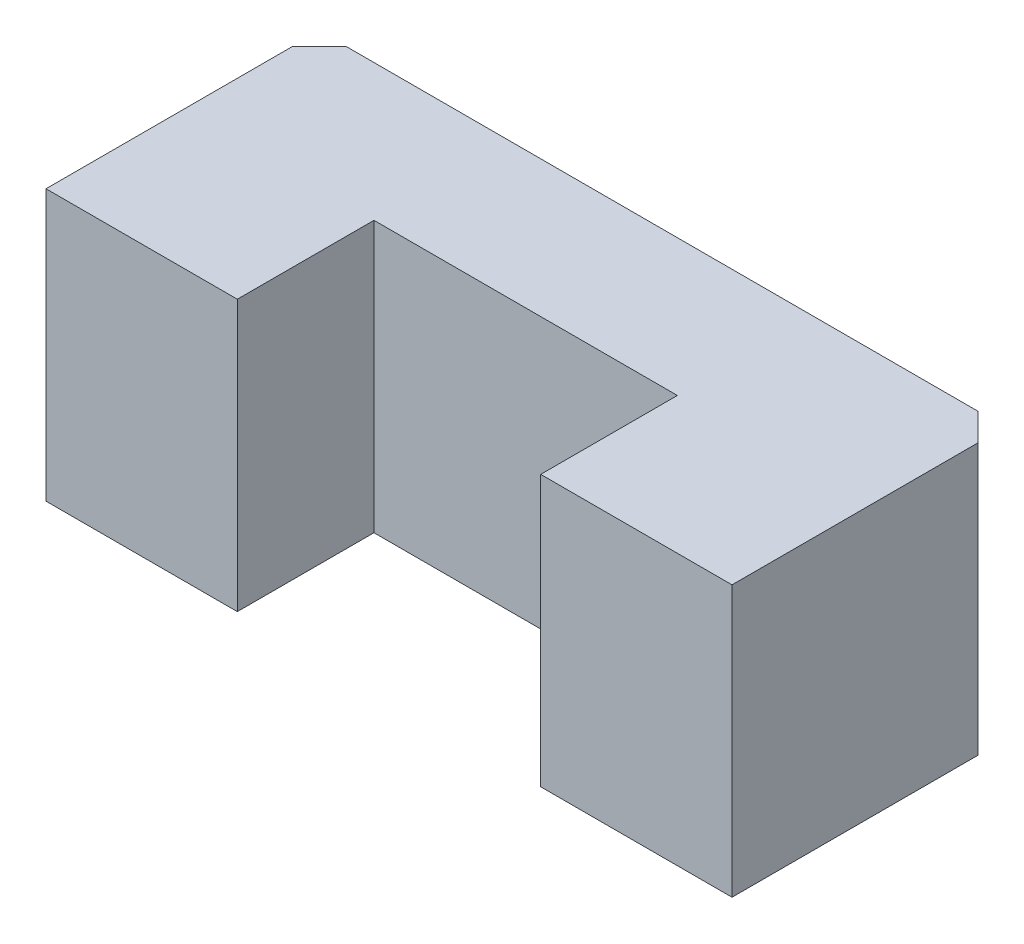
ISO-10303-21;
HEADER;
FILE_DESCRIPTION(('STEP AP214'),'2;1');
FILE_NAME('part.step','',(''),(''),'','','');
FILE_SCHEMA(('AUTOMOTIVE_DESIGN { 1 0 10303 214 1 1 1 1 }'));
ENDSEC;
DATA;
#1=APPLICATION_CONTEXT('core data for automotive mechanical design processes');
#2=APPLICATION_PROTOCOL_DEFINITION('international standard','automotive_design',2000,#1);
#3=PRODUCT_CONTEXT('',#1,'mechanical');
#4=PRODUCT('Part','Part','',(#3));
#5=PRODUCT_RELATED_PRODUCT_CATEGORY('part','',(#4));
#6=PRODUCT_DEFINITION_FORMATION('','',#4);
#7=PRODUCT_DEFINITION_CONTEXT('part definition',#1,'design');
#8=PRODUCT_DEFINITION('design','',#6,#7);
#9=PRODUCT_DEFINITION_SHAPE('','',#8);
#10=(LENGTH_UNIT() NAMED_UNIT(*) SI_UNIT(.MILLI.,.METRE.));
#11=(NAMED_UNIT(*) PLANE_ANGLE_UNIT() SI_UNIT($,.RADIAN.));
#12=(NAMED_UNIT(*) SI_UNIT($,.STERADIAN.) SOLID_ANGLE_UNIT());
#13=UNCERTAINTY_MEASURE_WITH_UNIT(LENGTH_MEASURE(1.E-05),#10,'distance_accuracy_value','');
#14=(GEOMETRIC_REPRESENTATION_CONTEXT(3) GLOBAL_UNCERTAINTY_ASSIGNED_CONTEXT((#13)) GLOBAL_UNIT_ASSIGNED_CONTEXT((#10,
#11,#12)) REPRESENTATION_CONTEXT('',''));
#15=CARTESIAN_POINT('',(0.,0.,0.));
#16=DIRECTION('',(0.,0.,1.));
#17=DIRECTION('',(1.,0.,0.));
#18=AXIS2_PLACEMENT_3D('',#15,#16,#17);
#19=CARTESIAN_POINT('',(0.,4.95,5.));
#20=DIRECTION('',(0.,1.,0.));
#21=DIRECTION('',(0.,0.,1.));
#22=AXIS2_PLACEMENT_3D('',#19,#20,#21);
#23=PLANE('',#22);
#24=DIRECTION('',(0.,0.,-1.));
#25=VECTOR('',#24,1.);
#26=CARTESIAN_POINT('',(12.55,4.95,10.));
#27=LINE('',#26,#25);
#28=CARTESIAN_POINT('',(12.55,4.95,10.));
#29=VERTEX_POINT('',#28);
#30=CARTESIAN_POINT('',(12.55,4.95,1.00000000000001));
#31=VERTEX_POINT('',#30);
#32=EDGE_CURVE('E142',#29,#31,#27,.T.);
#33=ORIENTED_EDGE('',*,*,#32,.T.);
#34=DIRECTION('',(-0.707106781186548,0.,-0.707106781186548));
#35=VECTOR('',#34,1.);
#36=CARTESIAN_POINT('',(8.275,4.95,-3.275));
#37=LINE('',#36,#35);
#38=CARTESIAN_POINT('',(11.55,4.95,0.));
#39=VERTEX_POINT('',#38);
#40=EDGE_CURVE('E43',#31,#39,#37,.T.);
#41=ORIENTED_EDGE('',*,*,#40,.T.);
#42=DIRECTION('',(1.,0.,0.));
#43=VECTOR('',#42,1.);
#44=CARTESIAN_POINT('',(0.,4.95,0.));
#45=LINE('',#44,#43);
#46=CARTESIAN_POINT('',(-11.55,4.95,0.));
#47=VERTEX_POINT('',#46);
#48=EDGE_CURVE('E194',#47,#39,#45,.T.);
#49=ORIENTED_EDGE('',*,*,#48,.F.);
#50=DIRECTION('',(0.707106781186549,0.,-0.707106781186546));
#51=VECTOR('',#50,1.);
#52=CARTESIAN_POINT('',(-8.27499999999998,4.95,-3.27500000000001));
#53=LINE('',#52,#51);
#54=CARTESIAN_POINT('',(-12.55,4.95,1.00000000000001));
#55=VERTEX_POINT('',#54);
#56=EDGE_CURVE('E50',#47,#55,#53,.F.);
#57=ORIENTED_EDGE('',*,*,#56,.T.);
#58=DIRECTION('',(0.,0.,-1.));
#59=VECTOR('',#58,1.);
#60=CARTESIAN_POINT('',(-12.55,4.95,10.));
#61=LINE('',#60,#59);
#62=CARTESIAN_POINT('',(-12.55,4.95,10.));
#63=VERTEX_POINT('',#62);
#64=EDGE_CURVE('E238',#63,#55,#61,.T.);
#65=ORIENTED_EDGE('',*,*,#64,.F.);
#66=DIRECTION('',(1.,0.,0.));
#67=VECTOR('',#66,1.);
#68=CARTESIAN_POINT('',(0.,4.95,10.));
#69=LINE('',#68,#67);
#70=CARTESIAN_POINT('',(-5.55,4.95,10.));
#71=VERTEX_POINT('',#70);
#72=EDGE_CURVE('E153',#63,#71,#69,.T.);
#73=ORIENTED_EDGE('',*,*,#72,.T.);
#74=DIRECTION('',(0.,0.,-1.));
#75=VECTOR('',#74,1.);
#76=CARTESIAN_POINT('',(-5.55,4.95,10.));
#77=LINE('',#76,#75);
#78=CARTESIAN_POINT('',(-5.55,4.95,5.));
#79=VERTEX_POINT('',#78);
#80=EDGE_CURVE('E168',#71,#79,#77,.T.);
#81=ORIENTED_EDGE('',*,*,#80,.T.);
#82=DIRECTION('',(1.,0.,0.));
#83=VECTOR('',#82,1.);
#84=CARTESIAN_POINT('',(0.,4.95,5.));
#85=LINE('',#84,#83);
#86=CARTESIAN_POINT('',(5.55,4.95,5.));
#87=VERTEX_POINT('',#86);
#88=EDGE_CURVE('E121',#79,#87,#85,.T.);
#89=ORIENTED_EDGE('',*,*,#88,.T.);
#90=DIRECTION('',(0.,0.,-1.));
#91=VECTOR('',#90,1.);
#92=CARTESIAN_POINT('',(5.55,4.95,10.));
#93=LINE('',#92,#91);
#94=CARTESIAN_POINT('',(5.55,4.95,10.));
#95=VERTEX_POINT('',#94);
#96=EDGE_CURVE('E114',#95,#87,#93,.T.);
#97=ORIENTED_EDGE('',*,*,#96,.F.);
#98=DIRECTION('',(1.,0.,0.));
#99=VECTOR('',#98,1.);
#100=CARTESIAN_POINT('',(0.,4.95,10.));
#101=LINE('',#100,#99);
#102=EDGE_CURVE('E117',#95,#29,#101,.T.);
#103=ORIENTED_EDGE('',*,*,#102,.T.);
#104=EDGE_LOOP('',(#33,#41,#49,#57,#65,#73,#81,#89,#97,#103));
#105=FACE_BOUND('',#104,.T.);
#106=ADVANCED_FACE('F35',(#105),#23,.T.);
#107=CARTESIAN_POINT('',(0.,-4.95,5.));
#108=DIRECTION('',(0.,1.,0.));
#109=DIRECTION('',(0.,0.,1.));
#110=AXIS2_PLACEMENT_3D('',#107,#108,#109);
#111=PLANE('',#110);
#112=DIRECTION('',(1.,0.,0.));
#113=VECTOR('',#112,1.);
#114=CARTESIAN_POINT('',(0.,-4.95,0.));
#115=LINE('',#114,#113);
#116=CARTESIAN_POINT('',(-11.55,-4.95,0.));
#117=VERTEX_POINT('',#116);
#118=CARTESIAN_POINT('',(11.55,-4.95,0.));
#119=VERTEX_POINT('',#118);
#120=EDGE_CURVE('E178',#117,#119,#115,.T.);
#121=ORIENTED_EDGE('',*,*,#120,.T.);
#122=DIRECTION('',(0.707106781186548,0.,0.707106781186548));
#123=VECTOR('',#122,1.);
#124=CARTESIAN_POINT('',(11.55,-4.95,0.));
#125=LINE('',#124,#123);
#126=CARTESIAN_POINT('',(12.55,-4.95,1.));
#127=VERTEX_POINT('',#126);
#128=EDGE_CURVE('E189',#119,#127,#125,.T.);
#129=ORIENTED_EDGE('',*,*,#128,.T.);
#130=DIRECTION('',(0.,0.,-1.));
#131=VECTOR('',#130,1.);
#132=CARTESIAN_POINT('',(12.55,-4.95,10.));
#133=LINE('',#132,#131);
#134=CARTESIAN_POINT('',(12.55,-4.95,10.));
#135=VERTEX_POINT('',#134);
#136=EDGE_CURVE('E144',#135,#127,#133,.T.);
#137=ORIENTED_EDGE('',*,*,#136,.F.);
#138=DIRECTION('',(1.,0.,0.));
#139=VECTOR('',#138,1.);
#140=CARTESIAN_POINT('',(0.,-4.95,10.));
#141=LINE('',#140,#139);
#142=CARTESIAN_POINT('',(5.55,-4.95,10.));
#143=VERTEX_POINT('',#142);
#144=EDGE_CURVE('E133',#143,#135,#141,.T.);
#145=ORIENTED_EDGE('',*,*,#144,.F.);
#146=DIRECTION('',(0.,0.,-1.));
#147=VECTOR('',#146,1.);
#148=CARTESIAN_POINT('',(5.55,-4.95,10.));
#149=LINE('',#148,#147);
#150=CARTESIAN_POINT('',(5.55,-4.95,5.));
#151=VERTEX_POINT('',#150);
#152=EDGE_CURVE('E125',#143,#151,#149,.T.);
#153=ORIENTED_EDGE('',*,*,#152,.T.);
#154=DIRECTION('',(1.,0.,0.));
#155=VECTOR('',#154,1.);
#156=CARTESIAN_POINT('',(0.,-4.95,5.));
#157=LINE('',#156,#155);
#158=CARTESIAN_POINT('',(-5.55,-4.95,5.));
#159=VERTEX_POINT('',#158);
#160=EDGE_CURVE('E184',#159,#151,#157,.T.);
#161=ORIENTED_EDGE('',*,*,#160,.F.);
#162=DIRECTION('',(0.,0.,-1.));
#163=VECTOR('',#162,1.);
#164=CARTESIAN_POINT('',(-5.55,-4.95,10.));
#165=LINE('',#164,#163);
#166=CARTESIAN_POINT('',(-5.55,-4.95,10.));
#167=VERTEX_POINT('',#166);
#168=EDGE_CURVE('E160',#167,#159,#165,.T.);
#169=ORIENTED_EDGE('',*,*,#168,.F.);
#170=DIRECTION('',(1.,0.,0.));
#171=VECTOR('',#170,1.);
#172=CARTESIAN_POINT('',(0.,-4.95,10.));
#173=LINE('',#172,#171);
#174=CARTESIAN_POINT('',(-12.55,-4.95,10.));
#175=VERTEX_POINT('',#174);
#176=EDGE_CURVE('E158',#175,#167,#173,.T.);
#177=ORIENTED_EDGE('',*,*,#176,.F.);
#178=DIRECTION('',(0.,0.,-1.));
#179=VECTOR('',#178,1.);
#180=CARTESIAN_POINT('',(-12.55,-4.95,10.));
#181=LINE('',#180,#179);
#182=CARTESIAN_POINT('',(-12.55,-4.95,1.));
#183=VERTEX_POINT('',#182);
#184=EDGE_CURVE('E163',#175,#183,#181,.T.);
#185=ORIENTED_EDGE('',*,*,#184,.T.);
#186=DIRECTION('',(-0.707106781186549,0.,0.707106781186546));
#187=VECTOR('',#186,1.);
#188=CARTESIAN_POINT('',(-12.55,-4.95,1.));
#189=LINE('',#188,#187);
#190=EDGE_CURVE('E187',#183,#117,#189,.F.);
#191=ORIENTED_EDGE('',*,*,#190,.T.);
#192=EDGE_LOOP('',(#121,#129,#137,#145,#153,#161,#169,#177,#185,#191));
#193=FACE_BOUND('',#192,.T.);
#194=ADVANCED_FACE('F205',(#193),#111,.F.);
#195=CARTESIAN_POINT('',(0.,0.,5.));
#196=DIRECTION('',(0.,0.,1.));
#197=DIRECTION('',(1.,0.,0.));
#198=AXIS2_PLACEMENT_3D('',#195,#196,#197);
#199=PLANE('',#198);
#200=DIRECTION('',(0.,-1.,0.));
#201=VECTOR('',#200,1.);
#202=CARTESIAN_POINT('',(5.55,0.,5.));
#203=LINE('',#202,#201);
#204=EDGE_CURVE('E175',#87,#151,#203,.T.);
#205=ORIENTED_EDGE('',*,*,#204,.F.);
#206=ORIENTED_EDGE('',*,*,#88,.F.);
#207=DIRECTION('',(0.,-1.,0.));
#208=VECTOR('',#207,1.);
#209=CARTESIAN_POINT('',(-5.55,0.,5.));
#210=LINE('',#209,#208);
#211=EDGE_CURVE('E246',#79,#159,#210,.T.);
#212=ORIENTED_EDGE('',*,*,#211,.T.);
#213=ORIENTED_EDGE('',*,*,#160,.T.);
#214=EDGE_LOOP('',(#205,#206,#212,#213));
#215=FACE_BOUND('',#214,.T.);
#216=ADVANCED_FACE('F221',(#215),#199,.T.);
#217=CARTESIAN_POINT('',(0.,0.,0.));
#218=DIRECTION('',(0.,0.,1.));
#219=DIRECTION('',(1.,0.,0.));
#220=AXIS2_PLACEMENT_3D('',#217,#218,#219);
#221=PLANE('',#220);
#222=ORIENTED_EDGE('',*,*,#48,.T.);
#223=DIRECTION('',(0.,-1.,0.));
#224=VECTOR('',#223,1.);
#225=CARTESIAN_POINT('',(11.55,-4.95,0.));
#226=LINE('',#225,#224);
#227=EDGE_CURVE('E183',#39,#119,#226,.T.);
#228=ORIENTED_EDGE('',*,*,#227,.T.);
#229=ORIENTED_EDGE('',*,*,#120,.F.);
#230=DIRECTION('',(0.,1.,0.));
#231=VECTOR('',#230,1.);
#232=CARTESIAN_POINT('',(-11.55,0.,0.));
#233=LINE('',#232,#231);
#234=EDGE_CURVE('E181',#117,#47,#233,.T.);
#235=ORIENTED_EDGE('',*,*,#234,.T.);
#236=EDGE_LOOP('',(#222,#228,#229,#235));
#237=FACE_BOUND('',#236,.T.);
#238=ADVANCED_FACE('F198',(#237),#221,.F.);
#239=CARTESIAN_POINT('',(-5.55,0.,10.));
#240=DIRECTION('',(1.,0.,0.));
#241=DIRECTION('',(0.,0.,-1.));
#242=AXIS2_PLACEMENT_3D('',#239,#240,#241);
#243=PLANE('',#242);
#244=ORIENTED_EDGE('',*,*,#211,.F.);
#245=ORIENTED_EDGE('',*,*,#80,.F.);
#246=DIRECTION('',(0.,-1.,0.));
#247=VECTOR('',#246,1.);
#248=CARTESIAN_POINT('',(-5.55,0.,10.));
#249=LINE('',#248,#247);
#250=EDGE_CURVE('E124',#71,#167,#249,.T.);
#251=ORIENTED_EDGE('',*,*,#250,.T.);
#252=ORIENTED_EDGE('',*,*,#168,.T.);
#253=EDGE_LOOP('',(#244,#245,#251,#252));
#254=FACE_BOUND('',#253,.T.);
#255=ADVANCED_FACE('F253',(#254),#243,.T.);
#256=CARTESIAN_POINT('',(-12.55,0.,10.));
#257=DIRECTION('',(1.,0.,0.));
#258=DIRECTION('',(0.,0.,-1.));
#259=AXIS2_PLACEMENT_3D('',#256,#257,#258);
#260=PLANE('',#259);
#261=ORIENTED_EDGE('',*,*,#64,.T.);
#262=DIRECTION('',(0.,-1.,0.));
#263=VECTOR('',#262,1.);
#264=CARTESIAN_POINT('',(-12.55,0.,1.));
#265=LINE('',#264,#263);
#266=EDGE_CURVE('E11',#55,#183,#265,.T.);
#267=ORIENTED_EDGE('',*,*,#266,.T.);
#268=ORIENTED_EDGE('',*,*,#184,.F.);
#269=DIRECTION('',(0.,-1.,0.));
#270=VECTOR('',#269,1.);
#271=CARTESIAN_POINT('',(-12.55,0.,10.));
#272=LINE('',#271,#270);
#273=EDGE_CURVE('E156',#63,#175,#272,.T.);
#274=ORIENTED_EDGE('',*,*,#273,.F.);
#275=EDGE_LOOP('',(#261,#267,#268,#274));
#276=FACE_BOUND('',#275,.T.);
#277=ADVANCED_FACE('F235',(#276),#260,.F.);
#278=CARTESIAN_POINT('',(0.,0.,10.));
#279=DIRECTION('',(0.,0.,1.));
#280=DIRECTION('',(1.,0.,0.));
#281=AXIS2_PLACEMENT_3D('',#278,#279,#280);
#282=PLANE('',#281);
#283=ORIENTED_EDGE('',*,*,#250,.F.);
#284=ORIENTED_EDGE('',*,*,#72,.F.);
#285=ORIENTED_EDGE('',*,*,#273,.T.);
#286=ORIENTED_EDGE('',*,*,#176,.T.);
#287=EDGE_LOOP('',(#283,#284,#285,#286));
#288=FACE_BOUND('',#287,.T.);
#289=ADVANCED_FACE('F214',(#288),#282,.T.);
#290=CARTESIAN_POINT('',(5.55,0.,10.));
#291=DIRECTION('',(1.,0.,0.));
#292=DIRECTION('',(0.,0.,-1.));
#293=AXIS2_PLACEMENT_3D('',#290,#291,#292);
#294=PLANE('',#293);
#295=ORIENTED_EDGE('',*,*,#96,.T.);
#296=ORIENTED_EDGE('',*,*,#204,.T.);
#297=ORIENTED_EDGE('',*,*,#152,.F.);
#298=DIRECTION('',(0.,-1.,0.));
#299=VECTOR('',#298,1.);
#300=CARTESIAN_POINT('',(5.55,0.,10.));
#301=LINE('',#300,#299);
#302=EDGE_CURVE('E128',#95,#143,#301,.T.);
#303=ORIENTED_EDGE('',*,*,#302,.F.);
#304=EDGE_LOOP('',(#295,#296,#297,#303));
#305=FACE_BOUND('',#304,.T.);
#306=ADVANCED_FACE('F129',(#305),#294,.F.);
#307=CARTESIAN_POINT('',(12.55,0.,10.));
#308=DIRECTION('',(1.,0.,0.));
#309=DIRECTION('',(0.,0.,-1.));
#310=AXIS2_PLACEMENT_3D('',#307,#308,#309);
#311=PLANE('',#310);
#312=ORIENTED_EDGE('',*,*,#136,.T.);
#313=DIRECTION('',(0.,1.,0.));
#314=VECTOR('',#313,1.);
#315=CARTESIAN_POINT('',(12.55,4.95,1.));
#316=LINE('',#315,#314);
#317=EDGE_CURVE('E58',#127,#31,#316,.T.);
#318=ORIENTED_EDGE('',*,*,#317,.T.);
#319=ORIENTED_EDGE('',*,*,#32,.F.);
#320=DIRECTION('',(0.,-1.,0.));
#321=VECTOR('',#320,1.);
#322=CARTESIAN_POINT('',(12.55,0.,10.));
#323=LINE('',#322,#321);
#324=EDGE_CURVE('E137',#29,#135,#323,.T.);
#325=ORIENTED_EDGE('',*,*,#324,.T.);
#326=EDGE_LOOP('',(#312,#318,#319,#325));
#327=FACE_BOUND('',#326,.T.);
#328=ADVANCED_FACE('F206',(#327),#311,.T.);
#329=CARTESIAN_POINT('',(0.,0.,10.));
#330=DIRECTION('',(0.,0.,1.));
#331=DIRECTION('',(1.,0.,0.));
#332=AXIS2_PLACEMENT_3D('',#329,#330,#331);
#333=PLANE('',#332);
#334=ORIENTED_EDGE('',*,*,#102,.F.);
#335=ORIENTED_EDGE('',*,*,#302,.T.);
#336=ORIENTED_EDGE('',*,*,#144,.T.);
#337=ORIENTED_EDGE('',*,*,#324,.F.);
#338=EDGE_LOOP('',(#334,#335,#336,#337));
#339=FACE_BOUND('',#338,.T.);
#340=ADVANCED_FACE('F135',(#339),#333,.T.);
#341=CARTESIAN_POINT('',(11.55,0.,0.));
#342=DIRECTION('',(0.707106781186547,0.,-0.707106781186547));
#343=DIRECTION('',(0.,1.,0.));
#344=AXIS2_PLACEMENT_3D('',#341,#342,#343);
#345=PLANE('',#344);
#346=ORIENTED_EDGE('',*,*,#40,.F.);
#347=ORIENTED_EDGE('',*,*,#317,.F.);
#348=ORIENTED_EDGE('',*,*,#128,.F.);
#349=ORIENTED_EDGE('',*,*,#227,.F.);
#350=EDGE_LOOP('',(#346,#347,#348,#349));
#351=FACE_BOUND('',#350,.T.);
#352=ADVANCED_FACE('F202',(#351),#345,.T.);
#353=CARTESIAN_POINT('',(-12.55,0.,1.));
#354=DIRECTION('',(0.707106781186546,0.,0.707106781186549));
#355=DIRECTION('',(0.,-1.,0.));
#356=AXIS2_PLACEMENT_3D('',#353,#354,#355);
#357=PLANE('',#356);
#358=ORIENTED_EDGE('',*,*,#56,.F.);
#359=ORIENTED_EDGE('',*,*,#234,.F.);
#360=ORIENTED_EDGE('',*,*,#190,.F.);
#361=ORIENTED_EDGE('',*,*,#266,.F.);
#362=EDGE_LOOP('',(#358,#359,#360,#361));
#363=FACE_BOUND('',#362,.T.);
#364=ADVANCED_FACE('F37',(#363),#357,.F.);
#365=CLOSED_SHELL('',(#106,#194,#216,#238,#255,#277,#289,#306,#328,#340,#352,#364));
#366=MANIFOLD_SOLID_BREP('B2',#365);
#367=ADVANCED_BREP_SHAPE_REPRESENTATION('',(#18,#366),#14);
#368=SHAPE_DEFINITION_REPRESENTATION(#9,#367);
ENDSEC;
END-ISO-10303-21;
